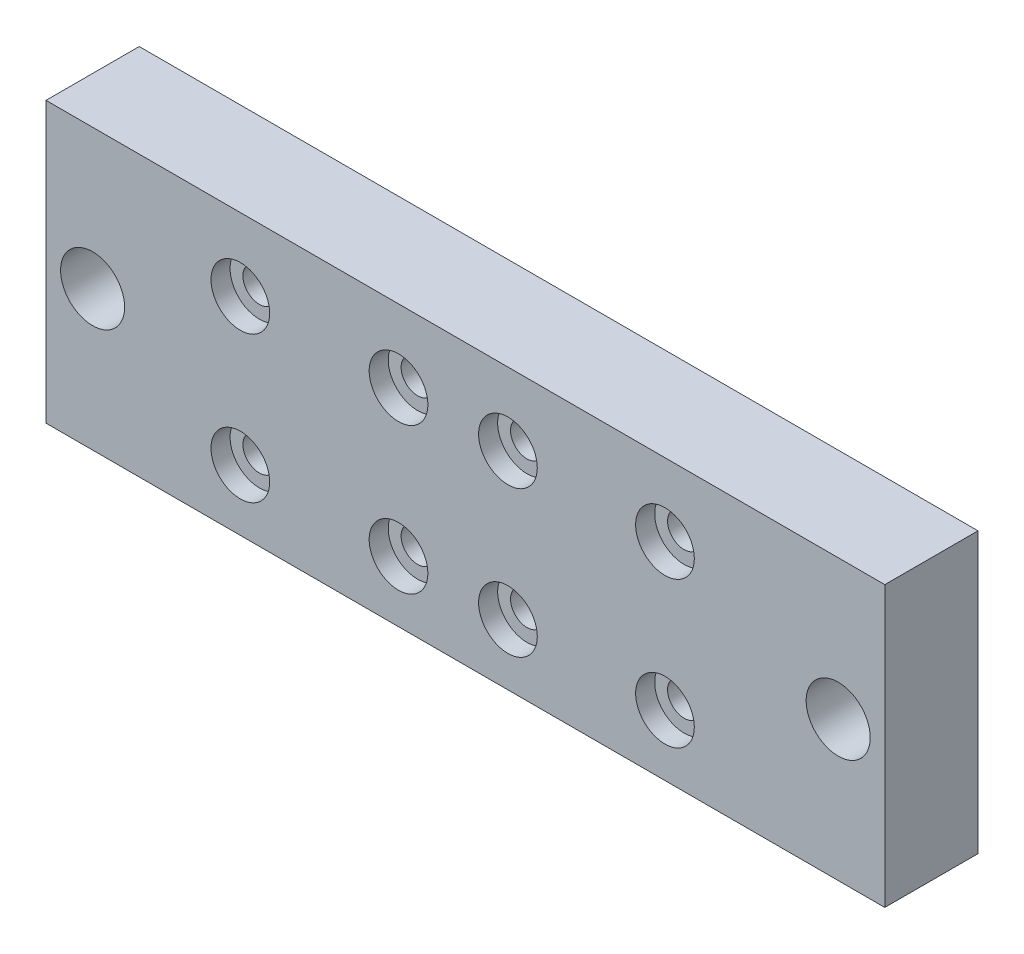
ISO-10303-21;
HEADER;
FILE_DESCRIPTION(('STEP AP214'),'2;1');
FILE_NAME('part.step','',(''),(''),'','','');
FILE_SCHEMA(('AUTOMOTIVE_DESIGN { 1 0 10303 214 1 1 1 1 }'));
ENDSEC;
DATA;
#1=APPLICATION_CONTEXT('core data for automotive mechanical design processes');
#2=APPLICATION_PROTOCOL_DEFINITION('international standard','automotive_design',2000,#1);
#3=PRODUCT_CONTEXT('',#1,'mechanical');
#4=PRODUCT('Part','Part','',(#3));
#5=PRODUCT_RELATED_PRODUCT_CATEGORY('part','',(#4));
#6=PRODUCT_DEFINITION_FORMATION('','',#4);
#7=PRODUCT_DEFINITION_CONTEXT('part definition',#1,'design');
#8=PRODUCT_DEFINITION('design','',#6,#7);
#9=PRODUCT_DEFINITION_SHAPE('','',#8);
#10=(LENGTH_UNIT() NAMED_UNIT(*) SI_UNIT(.MILLI.,.METRE.));
#11=(NAMED_UNIT(*) PLANE_ANGLE_UNIT() SI_UNIT($,.RADIAN.));
#12=(NAMED_UNIT(*) SI_UNIT($,.STERADIAN.) SOLID_ANGLE_UNIT());
#13=UNCERTAINTY_MEASURE_WITH_UNIT(LENGTH_MEASURE(1.E-05),#10,'distance_accuracy_value','');
#14=(GEOMETRIC_REPRESENTATION_CONTEXT(3) GLOBAL_UNCERTAINTY_ASSIGNED_CONTEXT((#13)) GLOBAL_UNIT_ASSIGNED_CONTEXT((#10,
#11,#12)) REPRESENTATION_CONTEXT('',''));
#15=CARTESIAN_POINT('',(0.,0.,0.));
#16=DIRECTION('',(0.,0.,1.));
#17=DIRECTION('',(1.,0.,0.));
#18=AXIS2_PLACEMENT_3D('',#15,#16,#17);
#19=CARTESIAN_POINT('',(0.,0.,12.7));
#20=DIRECTION('',(1.,0.,0.));
#21=DIRECTION('',(0.,0.,-1.));
#22=AXIS2_PLACEMENT_3D('',#19,#20,#21);
#23=PLANE('',#22);
#24=DIRECTION('',(0.,-1.,0.));
#25=VECTOR('',#24,1.);
#26=CARTESIAN_POINT('',(0.,0.,0.));
#27=LINE('',#26,#25);
#28=CARTESIAN_POINT('',(0.,38.1,0.));
#29=VERTEX_POINT('',#28);
#30=CARTESIAN_POINT('',(0.,0.,0.));
#31=VERTEX_POINT('',#30);
#32=EDGE_CURVE('E101',#29,#31,#27,.T.);
#33=ORIENTED_EDGE('',*,*,#32,.T.);
#34=DIRECTION('',(0.,0.,-1.));
#35=VECTOR('',#34,1.);
#36=CARTESIAN_POINT('',(0.,0.,12.7));
#37=LINE('',#36,#35);
#38=CARTESIAN_POINT('',(0.,0.,12.7));
#39=VERTEX_POINT('',#38);
#40=EDGE_CURVE('E11',#39,#31,#37,.T.);
#41=ORIENTED_EDGE('',*,*,#40,.F.);
#42=DIRECTION('',(0.,-1.,0.));
#43=VECTOR('',#42,1.);
#44=CARTESIAN_POINT('',(0.,0.,12.7));
#45=LINE('',#44,#43);
#46=CARTESIAN_POINT('',(0.,38.1,12.7));
#47=VERTEX_POINT('',#46);
#48=EDGE_CURVE('E88',#47,#39,#45,.T.);
#49=ORIENTED_EDGE('',*,*,#48,.F.);
#50=DIRECTION('',(0.,0.,-1.));
#51=VECTOR('',#50,1.);
#52=CARTESIAN_POINT('',(0.,38.1,12.7));
#53=LINE('',#52,#51);
#54=EDGE_CURVE('E97',#47,#29,#53,.T.);
#55=ORIENTED_EDGE('',*,*,#54,.T.);
#56=EDGE_LOOP('',(#33,#41,#49,#55));
#57=FACE_BOUND('',#56,.T.);
#58=ADVANCED_FACE('F35',(#57),#23,.F.);
#59=CARTESIAN_POINT('',(0.,0.,12.7));
#60=DIRECTION('',(0.,1.,0.));
#61=DIRECTION('',(0.,0.,1.));
#62=AXIS2_PLACEMENT_3D('',#59,#60,#61);
#63=PLANE('',#62);
#64=DIRECTION('',(1.,0.,0.));
#65=VECTOR('',#64,1.);
#66=CARTESIAN_POINT('',(0.,0.,0.));
#67=LINE('',#66,#65);
#68=CARTESIAN_POINT('',(114.3,0.,0.));
#69=VERTEX_POINT('',#68);
#70=EDGE_CURVE('E92',#31,#69,#67,.T.);
#71=ORIENTED_EDGE('',*,*,#70,.T.);
#72=DIRECTION('',(0.,0.,-1.));
#73=VECTOR('',#72,1.);
#74=CARTESIAN_POINT('',(114.3,0.,12.7));
#75=LINE('',#74,#73);
#76=CARTESIAN_POINT('',(114.3,0.,12.7));
#77=VERTEX_POINT('',#76);
#78=EDGE_CURVE('E44',#77,#69,#75,.T.);
#79=ORIENTED_EDGE('',*,*,#78,.F.);
#80=DIRECTION('',(1.,0.,0.));
#81=VECTOR('',#80,1.);
#82=CARTESIAN_POINT('',(0.,0.,12.7));
#83=LINE('',#82,#81);
#84=EDGE_CURVE('E83',#39,#77,#83,.T.);
#85=ORIENTED_EDGE('',*,*,#84,.F.);
#86=ORIENTED_EDGE('',*,*,#40,.T.);
#87=EDGE_LOOP('',(#71,#79,#85,#86));
#88=FACE_BOUND('',#87,.T.);
#89=ADVANCED_FACE('F91',(#88),#63,.F.);
#90=CARTESIAN_POINT('',(114.3,0.,12.7));
#91=DIRECTION('',(-1.,0.,0.));
#92=DIRECTION('',(0.,0.,1.));
#93=AXIS2_PLACEMENT_3D('',#90,#91,#92);
#94=PLANE('',#93);
#95=DIRECTION('',(0.,1.,0.));
#96=VECTOR('',#95,1.);
#97=CARTESIAN_POINT('',(114.3,0.,0.));
#98=LINE('',#97,#96);
#99=CARTESIAN_POINT('',(114.3,38.1,0.));
#100=VERTEX_POINT('',#99);
#101=EDGE_CURVE('E70',#69,#100,#98,.T.);
#102=ORIENTED_EDGE('',*,*,#101,.T.);
#103=DIRECTION('',(0.,0.,-1.));
#104=VECTOR('',#103,1.);
#105=CARTESIAN_POINT('',(114.3,38.1,12.7));
#106=LINE('',#105,#104);
#107=CARTESIAN_POINT('',(114.3,38.1,12.7));
#108=VERTEX_POINT('',#107);
#109=EDGE_CURVE('E93',#108,#100,#106,.T.);
#110=ORIENTED_EDGE('',*,*,#109,.F.);
#111=DIRECTION('',(0.,1.,0.));
#112=VECTOR('',#111,1.);
#113=CARTESIAN_POINT('',(114.3,0.,12.7));
#114=LINE('',#113,#112);
#115=EDGE_CURVE('E86',#77,#108,#114,.T.);
#116=ORIENTED_EDGE('',*,*,#115,.F.);
#117=ORIENTED_EDGE('',*,*,#78,.T.);
#118=EDGE_LOOP('',(#102,#110,#116,#117));
#119=FACE_BOUND('',#118,.T.);
#120=ADVANCED_FACE('F95',(#119),#94,.F.);
#121=CARTESIAN_POINT('',(0.,38.1,12.7));
#122=DIRECTION('',(0.,-1.,0.));
#123=DIRECTION('',(0.,0.,-1.));
#124=AXIS2_PLACEMENT_3D('',#121,#122,#123);
#125=PLANE('',#124);
#126=DIRECTION('',(-1.,0.,0.));
#127=VECTOR('',#126,1.);
#128=CARTESIAN_POINT('',(0.,38.1,0.));
#129=LINE('',#128,#127);
#130=EDGE_CURVE('E76',#100,#29,#129,.T.);
#131=ORIENTED_EDGE('',*,*,#130,.T.);
#132=ORIENTED_EDGE('',*,*,#54,.F.);
#133=DIRECTION('',(-1.,0.,0.));
#134=VECTOR('',#133,1.);
#135=CARTESIAN_POINT('',(0.,38.1,12.7));
#136=LINE('',#135,#134);
#137=EDGE_CURVE('E53',#108,#47,#136,.T.);
#138=ORIENTED_EDGE('',*,*,#137,.F.);
#139=ORIENTED_EDGE('',*,*,#109,.T.);
#140=EDGE_LOOP('',(#131,#132,#138,#139));
#141=FACE_BOUND('',#140,.T.);
#142=ADVANCED_FACE('F213',(#141),#125,.F.);
#143=CARTESIAN_POINT('',(0.,0.,12.7));
#144=DIRECTION('',(0.,0.,-1.));
#145=DIRECTION('',(-1.,0.,0.));
#146=AXIS2_PLACEMENT_3D('',#143,#144,#145);
#147=PLANE('',#146);
#148=CARTESIAN_POINT('',(6.34999999999999,19.05,12.7));
#149=DIRECTION('',(0.,0.,1.));
#150=DIRECTION('',(1.,0.,0.));
#151=AXIS2_PLACEMENT_3D('',#148,#149,#150);
#152=CIRCLE('',#151,4.365625);
#153=CARTESIAN_POINT('',(10.715625,19.05,12.7));
#154=VERTEX_POINT('',#153);
#155=EDGE_CURVE('E510',#154,#154,#152,.T.);
#156=ORIENTED_EDGE('',*,*,#155,.F.);
#157=EDGE_LOOP('',(#156));
#158=FACE_BOUND('',#157,.T.);
#159=CARTESIAN_POINT('',(107.95,19.05,12.7));
#160=DIRECTION('',(0.,0.,1.));
#161=DIRECTION('',(1.,0.,0.));
#162=AXIS2_PLACEMENT_3D('',#159,#160,#161);
#163=CIRCLE('',#162,4.365625);
#164=CARTESIAN_POINT('',(112.315625,19.05,12.7));
#165=VERTEX_POINT('',#164);
#166=EDGE_CURVE('E512',#165,#165,#163,.T.);
#167=ORIENTED_EDGE('',*,*,#166,.F.);
#168=EDGE_LOOP('',(#167));
#169=FACE_BOUND('',#168,.T.);
#170=CARTESIAN_POINT('',(26.4785372058469,28.2047734815833,12.7));
#171=DIRECTION('',(0.,0.,1.));
#172=DIRECTION('',(1.,0.,0.));
#173=AXIS2_PLACEMENT_3D('',#170,#171,#172);
#174=CIRCLE('',#173,3.99999999999999);
#175=CARTESIAN_POINT('',(30.4785372058469,28.2047734815833,12.7));
#176=VERTEX_POINT('',#175);
#177=EDGE_CURVE('E520',#176,#176,#174,.T.);
#178=ORIENTED_EDGE('',*,*,#177,.F.);
#179=EDGE_LOOP('',(#178));
#180=FACE_BOUND('',#179,.T.);
#181=CARTESIAN_POINT('',(48.0366294398635,28.2047734815833,12.7));
#182=DIRECTION('',(0.,0.,1.));
#183=DIRECTION('',(1.,0.,0.));
#184=AXIS2_PLACEMENT_3D('',#181,#182,#183);
#185=CIRCLE('',#184,3.99999999999999);
#186=CARTESIAN_POINT('',(52.0366294398635,28.2047734815833,12.7));
#187=VERTEX_POINT('',#186);
#188=EDGE_CURVE('E152',#187,#187,#185,.T.);
#189=ORIENTED_EDGE('',*,*,#188,.F.);
#190=EDGE_LOOP('',(#189));
#191=FACE_BOUND('',#190,.T.);
#192=CARTESIAN_POINT('',(62.9471428436403,28.2047734815833,12.7));
#193=DIRECTION('',(0.,0.,1.));
#194=DIRECTION('',(1.,0.,0.));
#195=AXIS2_PLACEMENT_3D('',#192,#193,#194);
#196=CIRCLE('',#195,3.99999999999999);
#197=CARTESIAN_POINT('',(66.9471428436403,28.2047734815833,12.7));
#198=VERTEX_POINT('',#197);
#199=EDGE_CURVE('E139',#198,#198,#196,.T.);
#200=ORIENTED_EDGE('',*,*,#199,.F.);
#201=EDGE_LOOP('',(#200));
#202=FACE_BOUND('',#201,.T.);
#203=CARTESIAN_POINT('',(84.3455589166382,28.2047734815833,12.7));
#204=DIRECTION('',(0.,0.,1.));
#205=DIRECTION('',(1.,0.,0.));
#206=AXIS2_PLACEMENT_3D('',#203,#204,#205);
#207=CIRCLE('',#206,3.99999999999999);
#208=CARTESIAN_POINT('',(88.3455589166382,28.2047734815833,12.7));
#209=VERTEX_POINT('',#208);
#210=EDGE_CURVE('E135',#209,#209,#207,.T.);
#211=ORIENTED_EDGE('',*,*,#210,.F.);
#212=EDGE_LOOP('',(#211));
#213=FACE_BOUND('',#212,.T.);
#214=CARTESIAN_POINT('',(84.3455589166382,8.3033395981218,12.7));
#215=DIRECTION('',(0.,0.,1.));
#216=DIRECTION('',(1.,0.,0.));
#217=AXIS2_PLACEMENT_3D('',#214,#215,#216);
#218=CIRCLE('',#217,3.99999999999999);
#219=CARTESIAN_POINT('',(88.3455589166382,8.3033395981218,12.7));
#220=VERTEX_POINT('',#219);
#221=EDGE_CURVE('E131',#220,#220,#218,.T.);
#222=ORIENTED_EDGE('',*,*,#221,.F.);
#223=EDGE_LOOP('',(#222));
#224=FACE_BOUND('',#223,.T.);
#225=CARTESIAN_POINT('',(62.9471428436403,8.3033395981218,12.7));
#226=DIRECTION('',(0.,0.,1.));
#227=DIRECTION('',(1.,0.,0.));
#228=AXIS2_PLACEMENT_3D('',#225,#226,#227);
#229=CIRCLE('',#228,3.99999999999999);
#230=CARTESIAN_POINT('',(66.9471428436403,8.3033395981218,12.7));
#231=VERTEX_POINT('',#230);
#232=EDGE_CURVE('E126',#231,#231,#229,.T.);
#233=ORIENTED_EDGE('',*,*,#232,.F.);
#234=EDGE_LOOP('',(#233));
#235=FACE_BOUND('',#234,.T.);
#236=CARTESIAN_POINT('',(48.0366294398635,8.3033395981218,12.7));
#237=DIRECTION('',(0.,0.,1.));
#238=DIRECTION('',(1.,0.,0.));
#239=AXIS2_PLACEMENT_3D('',#236,#237,#238);
#240=CIRCLE('',#239,3.99999999999999);
#241=CARTESIAN_POINT('',(52.0366294398635,8.3033395981218,12.7));
#242=VERTEX_POINT('',#241);
#243=EDGE_CURVE('E121',#242,#242,#240,.T.);
#244=ORIENTED_EDGE('',*,*,#243,.F.);
#245=EDGE_LOOP('',(#244));
#246=FACE_BOUND('',#245,.T.);
#247=CARTESIAN_POINT('',(26.4785372058469,8.3033395981218,12.7));
#248=DIRECTION('',(0.,0.,1.));
#249=DIRECTION('',(1.,0.,0.));
#250=AXIS2_PLACEMENT_3D('',#247,#248,#249);
#251=CIRCLE('',#250,3.99999999999999);
#252=CARTESIAN_POINT('',(30.4785372058469,8.3033395981218,12.7));
#253=VERTEX_POINT('',#252);
#254=EDGE_CURVE('E116',#253,#253,#251,.T.);
#255=ORIENTED_EDGE('',*,*,#254,.F.);
#256=EDGE_LOOP('',(#255));
#257=FACE_BOUND('',#256,.T.);
#258=ORIENTED_EDGE('',*,*,#48,.T.);
#259=ORIENTED_EDGE('',*,*,#84,.T.);
#260=ORIENTED_EDGE('',*,*,#115,.T.);
#261=ORIENTED_EDGE('',*,*,#137,.T.);
#262=EDGE_LOOP('',(#258,#259,#260,#261));
#263=FACE_BOUND('',#262,.T.);
#264=ADVANCED_FACE('F84',(#158,#169,#180,#191,#202,#213,#224,#235,#246,#257,#263),#147,.F.);
#265=CARTESIAN_POINT('',(0.,0.,0.));
#266=DIRECTION('',(0.,0.,-1.));
#267=DIRECTION('',(-1.,0.,0.));
#268=AXIS2_PLACEMENT_3D('',#265,#266,#267);
#269=PLANE('',#268);
#270=CARTESIAN_POINT('',(6.34999999999999,19.05,0.));
#271=DIRECTION('',(0.,0.,1.));
#272=DIRECTION('',(1.,0.,0.));
#273=AXIS2_PLACEMENT_3D('',#270,#271,#272);
#274=CIRCLE('',#273,4.365625);
#275=CARTESIAN_POINT('',(10.715625,19.05,0.));
#276=VERTEX_POINT('',#275);
#277=EDGE_CURVE('E508',#276,#276,#274,.T.);
#278=ORIENTED_EDGE('',*,*,#277,.T.);
#279=EDGE_LOOP('',(#278));
#280=FACE_BOUND('',#279,.T.);
#281=CARTESIAN_POINT('',(107.95,19.05,0.));
#282=DIRECTION('',(0.,0.,1.));
#283=DIRECTION('',(1.,0.,0.));
#284=AXIS2_PLACEMENT_3D('',#281,#282,#283);
#285=CIRCLE('',#284,4.365625);
#286=CARTESIAN_POINT('',(112.315625,19.05,0.));
#287=VERTEX_POINT('',#286);
#288=EDGE_CURVE('E517',#287,#287,#285,.T.);
#289=ORIENTED_EDGE('',*,*,#288,.T.);
#290=EDGE_LOOP('',(#289));
#291=FACE_BOUND('',#290,.T.);
#292=CARTESIAN_POINT('',(26.4785372058469,28.2047734815833,0.));
#293=DIRECTION('',(0.,0.,-1.));
#294=DIRECTION('',(-1.,0.,0.));
#295=AXIS2_PLACEMENT_3D('',#292,#293,#294);
#296=CIRCLE('',#295,2.24999999999999);
#297=CARTESIAN_POINT('',(24.2285372058469,28.2047734815833,0.));
#298=VERTEX_POINT('',#297);
#299=EDGE_CURVE('E38',#298,#298,#296,.T.);
#300=ORIENTED_EDGE('',*,*,#299,.F.);
#301=EDGE_LOOP('',(#300));
#302=FACE_BOUND('',#301,.T.);
#303=CARTESIAN_POINT('',(48.0366294398635,28.2047734815833,0.));
#304=DIRECTION('',(0.,0.,-1.));
#305=DIRECTION('',(-1.,0.,0.));
#306=AXIS2_PLACEMENT_3D('',#303,#304,#305);
#307=CIRCLE('',#306,2.24999999999999);
#308=CARTESIAN_POINT('',(45.7866294398635,28.2047734815833,0.));
#309=VERTEX_POINT('',#308);
#310=EDGE_CURVE('E137',#309,#309,#307,.T.);
#311=ORIENTED_EDGE('',*,*,#310,.F.);
#312=EDGE_LOOP('',(#311));
#313=FACE_BOUND('',#312,.T.);
#314=CARTESIAN_POINT('',(62.9471428436403,28.2047734815833,0.));
#315=DIRECTION('',(0.,0.,-1.));
#316=DIRECTION('',(-1.,0.,0.));
#317=AXIS2_PLACEMENT_3D('',#314,#315,#316);
#318=CIRCLE('',#317,2.25);
#319=CARTESIAN_POINT('',(60.6971428436403,28.2047734815833,0.));
#320=VERTEX_POINT('',#319);
#321=EDGE_CURVE('E133',#320,#320,#318,.T.);
#322=ORIENTED_EDGE('',*,*,#321,.F.);
#323=EDGE_LOOP('',(#322));
#324=FACE_BOUND('',#323,.T.);
#325=CARTESIAN_POINT('',(84.3455589166382,28.2047734815833,0.));
#326=DIRECTION('',(0.,0.,-1.));
#327=DIRECTION('',(-1.,0.,0.));
#328=AXIS2_PLACEMENT_3D('',#325,#326,#327);
#329=CIRCLE('',#328,2.25);
#330=CARTESIAN_POINT('',(82.0955589166382,28.2047734815833,0.));
#331=VERTEX_POINT('',#330);
#332=EDGE_CURVE('E128',#331,#331,#329,.T.);
#333=ORIENTED_EDGE('',*,*,#332,.F.);
#334=EDGE_LOOP('',(#333));
#335=FACE_BOUND('',#334,.T.);
#336=CARTESIAN_POINT('',(84.3455589166382,8.3033395981218,0.));
#337=DIRECTION('',(0.,0.,-1.));
#338=DIRECTION('',(-1.,0.,0.));
#339=AXIS2_PLACEMENT_3D('',#336,#337,#338);
#340=CIRCLE('',#339,2.25);
#341=CARTESIAN_POINT('',(82.0955589166382,8.3033395981218,0.));
#342=VERTEX_POINT('',#341);
#343=EDGE_CURVE('E123',#342,#342,#340,.T.);
#344=ORIENTED_EDGE('',*,*,#343,.F.);
#345=EDGE_LOOP('',(#344));
#346=FACE_BOUND('',#345,.T.);
#347=CARTESIAN_POINT('',(62.9471428436403,8.3033395981218,0.));
#348=DIRECTION('',(0.,0.,-1.));
#349=DIRECTION('',(-1.,0.,0.));
#350=AXIS2_PLACEMENT_3D('',#347,#348,#349);
#351=CIRCLE('',#350,2.25);
#352=CARTESIAN_POINT('',(60.6971428436403,8.3033395981218,0.));
#353=VERTEX_POINT('',#352);
#354=EDGE_CURVE('E118',#353,#353,#351,.T.);
#355=ORIENTED_EDGE('',*,*,#354,.F.);
#356=EDGE_LOOP('',(#355));
#357=FACE_BOUND('',#356,.T.);
#358=CARTESIAN_POINT('',(48.0366294398635,8.3033395981218,0.));
#359=DIRECTION('',(0.,0.,-1.));
#360=DIRECTION('',(-1.,0.,0.));
#361=AXIS2_PLACEMENT_3D('',#358,#359,#360);
#362=CIRCLE('',#361,2.24999999999999);
#363=CARTESIAN_POINT('',(45.7866294398635,8.3033395981218,0.));
#364=VERTEX_POINT('',#363);
#365=EDGE_CURVE('E113',#364,#364,#362,.T.);
#366=ORIENTED_EDGE('',*,*,#365,.F.);
#367=EDGE_LOOP('',(#366));
#368=FACE_BOUND('',#367,.T.);
#369=CARTESIAN_POINT('',(26.4785372058469,8.3033395981218,0.));
#370=DIRECTION('',(0.,0.,-1.));
#371=DIRECTION('',(-1.,0.,0.));
#372=AXIS2_PLACEMENT_3D('',#369,#370,#371);
#373=CIRCLE('',#372,2.24999999999999);
#374=CARTESIAN_POINT('',(24.2285372058469,8.3033395981218,0.));
#375=VERTEX_POINT('',#374);
#376=EDGE_CURVE('E104',#375,#375,#373,.T.);
#377=ORIENTED_EDGE('',*,*,#376,.F.);
#378=EDGE_LOOP('',(#377));
#379=FACE_BOUND('',#378,.T.);
#380=ORIENTED_EDGE('',*,*,#32,.F.);
#381=ORIENTED_EDGE('',*,*,#130,.F.);
#382=ORIENTED_EDGE('',*,*,#101,.F.);
#383=ORIENTED_EDGE('',*,*,#70,.F.);
#384=EDGE_LOOP('',(#380,#381,#382,#383));
#385=FACE_BOUND('',#384,.T.);
#386=ADVANCED_FACE('F212',(#280,#291,#302,#313,#324,#335,#346,#357,#368,#379,#385),#269,.T.);
#387=CARTESIAN_POINT('',(26.4785372058469,8.3033395981218,12.7));
#388=DIRECTION('',(0.,0.,1.));
#389=DIRECTION('',(1.,0.,0.));
#390=AXIS2_PLACEMENT_3D('',#387,#388,#389);
#391=CYLINDRICAL_SURFACE('',#390,2.24999999999999);
#392=ORIENTED_EDGE('',*,*,#376,.T.);
#393=EDGE_LOOP('',(#392));
#394=FACE_BOUND('',#393,.T.);
#395=CARTESIAN_POINT('',(26.4785372058469,8.3033395981218,10.1));
#396=DIRECTION('',(0.,0.,1.));
#397=DIRECTION('',(1.,0.,0.));
#398=AXIS2_PLACEMENT_3D('',#395,#396,#397);
#399=CIRCLE('',#398,2.25);
#400=CARTESIAN_POINT('',(28.7285372058469,8.3033395981218,10.1));
#401=VERTEX_POINT('',#400);
#402=EDGE_CURVE('E112',#401,#401,#399,.T.);
#403=ORIENTED_EDGE('',*,*,#402,.T.);
#404=EDGE_LOOP('',(#403));
#405=FACE_BOUND('',#404,.T.);
#406=ADVANCED_FACE('F196',(#394,#405),#391,.F.);
#407=CARTESIAN_POINT('',(28.7285372058469,8.3033395981218,10.1));
#408=DIRECTION('',(0.,0.,-1.));
#409=DIRECTION('',(-1.,0.,0.));
#410=AXIS2_PLACEMENT_3D('',#407,#408,#409);
#411=PLANE('',#410);
#412=ORIENTED_EDGE('',*,*,#402,.F.);
#413=EDGE_LOOP('',(#412));
#414=FACE_BOUND('',#413,.T.);
#415=CARTESIAN_POINT('',(26.4785372058469,8.3033395981218,10.1));
#416=DIRECTION('',(0.,0.,1.));
#417=DIRECTION('',(1.,0.,0.));
#418=AXIS2_PLACEMENT_3D('',#415,#416,#417);
#419=CIRCLE('',#418,3.99999999999999);
#420=CARTESIAN_POINT('',(30.4785372058469,8.3033395981218,10.1));
#421=VERTEX_POINT('',#420);
#422=EDGE_CURVE('E190',#421,#421,#419,.T.);
#423=ORIENTED_EDGE('',*,*,#422,.T.);
#424=EDGE_LOOP('',(#423));
#425=FACE_BOUND('',#424,.T.);
#426=ADVANCED_FACE('F198',(#414,#425),#411,.F.);
#427=CARTESIAN_POINT('',(26.4785372058469,8.3033395981218,12.7));
#428=DIRECTION('',(0.,0.,1.));
#429=DIRECTION('',(1.,0.,0.));
#430=AXIS2_PLACEMENT_3D('',#427,#428,#429);
#431=CYLINDRICAL_SURFACE('',#430,3.99999999999999);
#432=ORIENTED_EDGE('',*,*,#422,.F.);
#433=EDGE_LOOP('',(#432));
#434=FACE_BOUND('',#433,.T.);
#435=ORIENTED_EDGE('',*,*,#254,.T.);
#436=EDGE_LOOP('',(#435));
#437=FACE_BOUND('',#436,.T.);
#438=ADVANCED_FACE('F201',(#434,#437),#431,.F.);
#439=CARTESIAN_POINT('',(48.0366294398635,8.3033395981218,12.7));
#440=DIRECTION('',(0.,0.,1.));
#441=DIRECTION('',(1.,0.,0.));
#442=AXIS2_PLACEMENT_3D('',#439,#440,#441);
#443=CYLINDRICAL_SURFACE('',#442,2.24999999999999);
#444=ORIENTED_EDGE('',*,*,#365,.T.);
#445=EDGE_LOOP('',(#444));
#446=FACE_BOUND('',#445,.T.);
#447=CARTESIAN_POINT('',(48.0366294398635,8.3033395981218,10.1));
#448=DIRECTION('',(0.,0.,1.));
#449=DIRECTION('',(1.,0.,0.));
#450=AXIS2_PLACEMENT_3D('',#447,#448,#449);
#451=CIRCLE('',#450,2.25);
#452=CARTESIAN_POINT('',(50.2866294398635,8.3033395981218,10.1));
#453=VERTEX_POINT('',#452);
#454=EDGE_CURVE('E117',#453,#453,#451,.T.);
#455=ORIENTED_EDGE('',*,*,#454,.T.);
#456=EDGE_LOOP('',(#455));
#457=FACE_BOUND('',#456,.T.);
#458=ADVANCED_FACE('F207',(#446,#457),#443,.F.);
#459=CARTESIAN_POINT('',(50.2866294398635,8.3033395981218,10.1));
#460=DIRECTION('',(0.,0.,-1.));
#461=DIRECTION('',(-1.,0.,0.));
#462=AXIS2_PLACEMENT_3D('',#459,#460,#461);
#463=PLANE('',#462);
#464=ORIENTED_EDGE('',*,*,#454,.F.);
#465=EDGE_LOOP('',(#464));
#466=FACE_BOUND('',#465,.T.);
#467=CARTESIAN_POINT('',(48.0366294398635,8.3033395981218,10.1));
#468=DIRECTION('',(0.,0.,1.));
#469=DIRECTION('',(1.,0.,0.));
#470=AXIS2_PLACEMENT_3D('',#467,#468,#469);
#471=CIRCLE('',#470,3.99999999999999);
#472=CARTESIAN_POINT('',(52.0366294398635,8.3033395981218,10.1));
#473=VERTEX_POINT('',#472);
#474=EDGE_CURVE('E183',#473,#473,#471,.T.);
#475=ORIENTED_EDGE('',*,*,#474,.T.);
#476=EDGE_LOOP('',(#475));
#477=FACE_BOUND('',#476,.T.);
#478=ADVANCED_FACE('F274',(#466,#477),#463,.F.);
#479=CARTESIAN_POINT('',(48.0366294398635,8.3033395981218,12.7));
#480=DIRECTION('',(0.,0.,1.));
#481=DIRECTION('',(1.,0.,0.));
#482=AXIS2_PLACEMENT_3D('',#479,#480,#481);
#483=CYLINDRICAL_SURFACE('',#482,3.99999999999999);
#484=ORIENTED_EDGE('',*,*,#474,.F.);
#485=EDGE_LOOP('',(#484));
#486=FACE_BOUND('',#485,.T.);
#487=ORIENTED_EDGE('',*,*,#243,.T.);
#488=EDGE_LOOP('',(#487));
#489=FACE_BOUND('',#488,.T.);
#490=ADVANCED_FACE('F284',(#486,#489),#483,.F.);
#491=CARTESIAN_POINT('',(62.9471428436403,8.3033395981218,12.7));
#492=DIRECTION('',(0.,0.,1.));
#493=DIRECTION('',(1.,0.,0.));
#494=AXIS2_PLACEMENT_3D('',#491,#492,#493);
#495=CYLINDRICAL_SURFACE('',#494,2.25);
#496=ORIENTED_EDGE('',*,*,#354,.T.);
#497=EDGE_LOOP('',(#496));
#498=FACE_BOUND('',#497,.T.);
#499=CARTESIAN_POINT('',(62.9471428436403,8.3033395981218,10.1));
#500=DIRECTION('',(0.,0.,1.));
#501=DIRECTION('',(1.,0.,0.));
#502=AXIS2_PLACEMENT_3D('',#499,#500,#501);
#503=CIRCLE('',#502,2.25);
#504=CARTESIAN_POINT('',(65.1971428436403,8.3033395981218,10.1));
#505=VERTEX_POINT('',#504);
#506=EDGE_CURVE('E122',#505,#505,#503,.T.);
#507=ORIENTED_EDGE('',*,*,#506,.T.);
#508=EDGE_LOOP('',(#507));
#509=FACE_BOUND('',#508,.T.);
#510=ADVANCED_FACE('F294',(#498,#509),#495,.F.);
#511=CARTESIAN_POINT('',(65.1971428436403,8.3033395981218,10.1));
#512=DIRECTION('',(0.,0.,-1.));
#513=DIRECTION('',(-1.,0.,0.));
#514=AXIS2_PLACEMENT_3D('',#511,#512,#513);
#515=PLANE('',#514);
#516=ORIENTED_EDGE('',*,*,#506,.F.);
#517=EDGE_LOOP('',(#516));
#518=FACE_BOUND('',#517,.T.);
#519=CARTESIAN_POINT('',(62.9471428436403,8.3033395981218,10.1));
#520=DIRECTION('',(0.,0.,1.));
#521=DIRECTION('',(1.,0.,0.));
#522=AXIS2_PLACEMENT_3D('',#519,#520,#521);
#523=CIRCLE('',#522,3.99999999999999);
#524=CARTESIAN_POINT('',(66.9471428436403,8.3033395981218,10.1));
#525=VERTEX_POINT('',#524);
#526=EDGE_CURVE('E176',#525,#525,#523,.T.);
#527=ORIENTED_EDGE('',*,*,#526,.T.);
#528=EDGE_LOOP('',(#527));
#529=FACE_BOUND('',#528,.T.);
#530=ADVANCED_FACE('F304',(#518,#529),#515,.F.);
#531=CARTESIAN_POINT('',(62.9471428436403,8.3033395981218,12.7));
#532=DIRECTION('',(0.,0.,1.));
#533=DIRECTION('',(1.,0.,0.));
#534=AXIS2_PLACEMENT_3D('',#531,#532,#533);
#535=CYLINDRICAL_SURFACE('',#534,3.99999999999999);
#536=ORIENTED_EDGE('',*,*,#526,.F.);
#537=EDGE_LOOP('',(#536));
#538=FACE_BOUND('',#537,.T.);
#539=ORIENTED_EDGE('',*,*,#232,.T.);
#540=EDGE_LOOP('',(#539));
#541=FACE_BOUND('',#540,.T.);
#542=ADVANCED_FACE('F314',(#538,#541),#535,.F.);
#543=CARTESIAN_POINT('',(84.3455589166382,8.3033395981218,12.7));
#544=DIRECTION('',(0.,0.,1.));
#545=DIRECTION('',(1.,0.,0.));
#546=AXIS2_PLACEMENT_3D('',#543,#544,#545);
#547=CYLINDRICAL_SURFACE('',#546,2.25);
#548=ORIENTED_EDGE('',*,*,#343,.T.);
#549=EDGE_LOOP('',(#548));
#550=FACE_BOUND('',#549,.T.);
#551=CARTESIAN_POINT('',(84.3455589166382,8.3033395981218,10.1));
#552=DIRECTION('',(0.,0.,1.));
#553=DIRECTION('',(1.,0.,0.));
#554=AXIS2_PLACEMENT_3D('',#551,#552,#553);
#555=CIRCLE('',#554,2.25);
#556=CARTESIAN_POINT('',(86.5955589166382,8.3033395981218,10.1));
#557=VERTEX_POINT('',#556);
#558=EDGE_CURVE('E127',#557,#557,#555,.T.);
#559=ORIENTED_EDGE('',*,*,#558,.T.);
#560=EDGE_LOOP('',(#559));
#561=FACE_BOUND('',#560,.T.);
#562=ADVANCED_FACE('F324',(#550,#561),#547,.F.);
#563=CARTESIAN_POINT('',(86.5955589166382,8.3033395981218,10.1));
#564=DIRECTION('',(0.,0.,-1.));
#565=DIRECTION('',(-1.,0.,0.));
#566=AXIS2_PLACEMENT_3D('',#563,#564,#565);
#567=PLANE('',#566);
#568=ORIENTED_EDGE('',*,*,#558,.F.);
#569=EDGE_LOOP('',(#568));
#570=FACE_BOUND('',#569,.T.);
#571=CARTESIAN_POINT('',(84.3455589166382,8.3033395981218,10.1));
#572=DIRECTION('',(0.,0.,1.));
#573=DIRECTION('',(1.,0.,0.));
#574=AXIS2_PLACEMENT_3D('',#571,#572,#573);
#575=CIRCLE('',#574,3.99999999999999);
#576=CARTESIAN_POINT('',(88.3455589166382,8.3033395981218,10.1));
#577=VERTEX_POINT('',#576);
#578=EDGE_CURVE('E169',#577,#577,#575,.T.);
#579=ORIENTED_EDGE('',*,*,#578,.T.);
#580=EDGE_LOOP('',(#579));
#581=FACE_BOUND('',#580,.T.);
#582=ADVANCED_FACE('F334',(#570,#581),#567,.F.);
#583=CARTESIAN_POINT('',(84.3455589166382,8.3033395981218,12.7));
#584=DIRECTION('',(0.,0.,1.));
#585=DIRECTION('',(1.,0.,0.));
#586=AXIS2_PLACEMENT_3D('',#583,#584,#585);
#587=CYLINDRICAL_SURFACE('',#586,3.99999999999999);
#588=ORIENTED_EDGE('',*,*,#578,.F.);
#589=EDGE_LOOP('',(#588));
#590=FACE_BOUND('',#589,.T.);
#591=ORIENTED_EDGE('',*,*,#221,.T.);
#592=EDGE_LOOP('',(#591));
#593=FACE_BOUND('',#592,.T.);
#594=ADVANCED_FACE('F344',(#590,#593),#587,.F.);
#595=CARTESIAN_POINT('',(84.3455589166382,28.2047734815833,12.7));
#596=DIRECTION('',(0.,0.,1.));
#597=DIRECTION('',(1.,0.,0.));
#598=AXIS2_PLACEMENT_3D('',#595,#596,#597);
#599=CYLINDRICAL_SURFACE('',#598,2.25);
#600=ORIENTED_EDGE('',*,*,#332,.T.);
#601=EDGE_LOOP('',(#600));
#602=FACE_BOUND('',#601,.T.);
#603=CARTESIAN_POINT('',(84.3455589166382,28.2047734815833,10.1));
#604=DIRECTION('',(0.,0.,1.));
#605=DIRECTION('',(1.,0.,0.));
#606=AXIS2_PLACEMENT_3D('',#603,#604,#605);
#607=CIRCLE('',#606,2.25);
#608=CARTESIAN_POINT('',(86.5955589166382,28.2047734815833,10.1));
#609=VERTEX_POINT('',#608);
#610=EDGE_CURVE('E132',#609,#609,#607,.T.);
#611=ORIENTED_EDGE('',*,*,#610,.T.);
#612=EDGE_LOOP('',(#611));
#613=FACE_BOUND('',#612,.T.);
#614=ADVANCED_FACE('F354',(#602,#613),#599,.F.);
#615=CARTESIAN_POINT('',(86.5955589166382,28.2047734815833,10.1));
#616=DIRECTION('',(0.,0.,-1.));
#617=DIRECTION('',(-1.,0.,0.));
#618=AXIS2_PLACEMENT_3D('',#615,#616,#617);
#619=PLANE('',#618);
#620=ORIENTED_EDGE('',*,*,#610,.F.);
#621=EDGE_LOOP('',(#620));
#622=FACE_BOUND('',#621,.T.);
#623=CARTESIAN_POINT('',(84.3455589166382,28.2047734815833,10.1));
#624=DIRECTION('',(0.,0.,1.));
#625=DIRECTION('',(1.,0.,0.));
#626=AXIS2_PLACEMENT_3D('',#623,#624,#625);
#627=CIRCLE('',#626,3.99999999999999);
#628=CARTESIAN_POINT('',(88.3455589166382,28.2047734815833,10.1));
#629=VERTEX_POINT('',#628);
#630=EDGE_CURVE('E162',#629,#629,#627,.T.);
#631=ORIENTED_EDGE('',*,*,#630,.T.);
#632=EDGE_LOOP('',(#631));
#633=FACE_BOUND('',#632,.T.);
#634=ADVANCED_FACE('F364',(#622,#633),#619,.F.);
#635=CARTESIAN_POINT('',(84.3455589166382,28.2047734815833,12.7));
#636=DIRECTION('',(0.,0.,1.));
#637=DIRECTION('',(1.,0.,0.));
#638=AXIS2_PLACEMENT_3D('',#635,#636,#637);
#639=CYLINDRICAL_SURFACE('',#638,3.99999999999999);
#640=ORIENTED_EDGE('',*,*,#630,.F.);
#641=EDGE_LOOP('',(#640));
#642=FACE_BOUND('',#641,.T.);
#643=ORIENTED_EDGE('',*,*,#210,.T.);
#644=EDGE_LOOP('',(#643));
#645=FACE_BOUND('',#644,.T.);
#646=ADVANCED_FACE('F374',(#642,#645),#639,.F.);
#647=CARTESIAN_POINT('',(62.9471428436403,28.2047734815833,12.7));
#648=DIRECTION('',(0.,0.,1.));
#649=DIRECTION('',(1.,0.,0.));
#650=AXIS2_PLACEMENT_3D('',#647,#648,#649);
#651=CYLINDRICAL_SURFACE('',#650,2.25);
#652=ORIENTED_EDGE('',*,*,#321,.T.);
#653=EDGE_LOOP('',(#652));
#654=FACE_BOUND('',#653,.T.);
#655=CARTESIAN_POINT('',(62.9471428436403,28.2047734815833,10.1));
#656=DIRECTION('',(0.,0.,1.));
#657=DIRECTION('',(1.,0.,0.));
#658=AXIS2_PLACEMENT_3D('',#655,#656,#657);
#659=CIRCLE('',#658,2.25);
#660=CARTESIAN_POINT('',(65.1971428436403,28.2047734815833,10.1));
#661=VERTEX_POINT('',#660);
#662=EDGE_CURVE('E136',#661,#661,#659,.T.);
#663=ORIENTED_EDGE('',*,*,#662,.T.);
#664=EDGE_LOOP('',(#663));
#665=FACE_BOUND('',#664,.T.);
#666=ADVANCED_FACE('F384',(#654,#665),#651,.F.);
#667=CARTESIAN_POINT('',(65.1971428436403,28.2047734815833,10.1));
#668=DIRECTION('',(0.,0.,-1.));
#669=DIRECTION('',(-1.,0.,0.));
#670=AXIS2_PLACEMENT_3D('',#667,#668,#669);
#671=PLANE('',#670);
#672=ORIENTED_EDGE('',*,*,#662,.F.);
#673=EDGE_LOOP('',(#672));
#674=FACE_BOUND('',#673,.T.);
#675=CARTESIAN_POINT('',(62.9471428436403,28.2047734815833,10.1));
#676=DIRECTION('',(0.,0.,1.));
#677=DIRECTION('',(1.,0.,0.));
#678=AXIS2_PLACEMENT_3D('',#675,#676,#677);
#679=CIRCLE('',#678,3.99999999999999);
#680=CARTESIAN_POINT('',(66.9471428436403,28.2047734815833,10.1));
#681=VERTEX_POINT('',#680);
#682=EDGE_CURVE('E144',#681,#681,#679,.T.);
#683=ORIENTED_EDGE('',*,*,#682,.T.);
#684=EDGE_LOOP('',(#683));
#685=FACE_BOUND('',#684,.T.);
#686=ADVANCED_FACE('F394',(#674,#685),#671,.F.);
#687=CARTESIAN_POINT('',(62.9471428436403,28.2047734815833,12.7));
#688=DIRECTION('',(0.,0.,1.));
#689=DIRECTION('',(1.,0.,0.));
#690=AXIS2_PLACEMENT_3D('',#687,#688,#689);
#691=CYLINDRICAL_SURFACE('',#690,3.99999999999999);
#692=ORIENTED_EDGE('',*,*,#682,.F.);
#693=EDGE_LOOP('',(#692));
#694=FACE_BOUND('',#693,.T.);
#695=ORIENTED_EDGE('',*,*,#199,.T.);
#696=EDGE_LOOP('',(#695));
#697=FACE_BOUND('',#696,.T.);
#698=ADVANCED_FACE('F404',(#694,#697),#691,.F.);
#699=CARTESIAN_POINT('',(48.0366294398635,28.2047734815833,12.7));
#700=DIRECTION('',(0.,0.,1.));
#701=DIRECTION('',(1.,0.,0.));
#702=AXIS2_PLACEMENT_3D('',#699,#700,#701);
#703=CYLINDRICAL_SURFACE('',#702,2.24999999999999);
#704=ORIENTED_EDGE('',*,*,#310,.T.);
#705=EDGE_LOOP('',(#704));
#706=FACE_BOUND('',#705,.T.);
#707=CARTESIAN_POINT('',(48.0366294398635,28.2047734815833,10.1));
#708=DIRECTION('',(0.,0.,1.));
#709=DIRECTION('',(1.,0.,0.));
#710=AXIS2_PLACEMENT_3D('',#707,#708,#709);
#711=CIRCLE('',#710,2.25);
#712=CARTESIAN_POINT('',(50.2866294398635,28.2047734815833,10.1));
#713=VERTEX_POINT('',#712);
#714=EDGE_CURVE('E140',#713,#713,#711,.T.);
#715=ORIENTED_EDGE('',*,*,#714,.T.);
#716=EDGE_LOOP('',(#715));
#717=FACE_BOUND('',#716,.T.);
#718=ADVANCED_FACE('F414',(#706,#717),#703,.F.);
#719=CARTESIAN_POINT('',(50.2866294398635,28.2047734815833,10.1));
#720=DIRECTION('',(0.,0.,-1.));
#721=DIRECTION('',(-1.,0.,0.));
#722=AXIS2_PLACEMENT_3D('',#719,#720,#721);
#723=PLANE('',#722);
#724=ORIENTED_EDGE('',*,*,#714,.F.);
#725=EDGE_LOOP('',(#724));
#726=FACE_BOUND('',#725,.T.);
#727=CARTESIAN_POINT('',(48.0366294398635,28.2047734815833,10.1));
#728=DIRECTION('',(0.,0.,1.));
#729=DIRECTION('',(1.,0.,0.));
#730=AXIS2_PLACEMENT_3D('',#727,#728,#729);
#731=CIRCLE('',#730,3.99999999999999);
#732=CARTESIAN_POINT('',(52.0366294398635,28.2047734815833,10.1));
#733=VERTEX_POINT('',#732);
#734=EDGE_CURVE('E147',#733,#733,#731,.T.);
#735=ORIENTED_EDGE('',*,*,#734,.T.);
#736=EDGE_LOOP('',(#735));
#737=FACE_BOUND('',#736,.T.);
#738=ADVANCED_FACE('F424',(#726,#737),#723,.F.);
#739=CARTESIAN_POINT('',(48.0366294398635,28.2047734815833,12.7));
#740=DIRECTION('',(0.,0.,1.));
#741=DIRECTION('',(1.,0.,0.));
#742=AXIS2_PLACEMENT_3D('',#739,#740,#741);
#743=CYLINDRICAL_SURFACE('',#742,3.99999999999999);
#744=ORIENTED_EDGE('',*,*,#734,.F.);
#745=EDGE_LOOP('',(#744));
#746=FACE_BOUND('',#745,.T.);
#747=ORIENTED_EDGE('',*,*,#188,.T.);
#748=EDGE_LOOP('',(#747));
#749=FACE_BOUND('',#748,.T.);
#750=ADVANCED_FACE('F433',(#746,#749),#743,.F.);
#751=CARTESIAN_POINT('',(26.4785372058469,28.2047734815833,12.7));
#752=DIRECTION('',(0.,0.,1.));
#753=DIRECTION('',(1.,0.,0.));
#754=AXIS2_PLACEMENT_3D('',#751,#752,#753);
#755=CYLINDRICAL_SURFACE('',#754,2.24999999999999);
#756=ORIENTED_EDGE('',*,*,#299,.T.);
#757=EDGE_LOOP('',(#756));
#758=FACE_BOUND('',#757,.T.);
#759=CARTESIAN_POINT('',(26.4785372058469,28.2047734815833,10.1));
#760=DIRECTION('',(0.,0.,1.));
#761=DIRECTION('',(1.,0.,0.));
#762=AXIS2_PLACEMENT_3D('',#759,#760,#761);
#763=CIRCLE('',#762,2.25);
#764=CARTESIAN_POINT('',(28.7285372058469,28.2047734815833,10.1));
#765=VERTEX_POINT('',#764);
#766=EDGE_CURVE('E526',#765,#765,#763,.T.);
#767=ORIENTED_EDGE('',*,*,#766,.T.);
#768=EDGE_LOOP('',(#767));
#769=FACE_BOUND('',#768,.T.);
#770=ADVANCED_FACE('F443',(#758,#769),#755,.F.);
#771=CARTESIAN_POINT('',(28.7285372058469,28.2047734815833,10.1));
#772=DIRECTION('',(0.,0.,-1.));
#773=DIRECTION('',(-1.,0.,0.));
#774=AXIS2_PLACEMENT_3D('',#771,#772,#773);
#775=PLANE('',#774);
#776=ORIENTED_EDGE('',*,*,#766,.F.);
#777=EDGE_LOOP('',(#776));
#778=FACE_BOUND('',#777,.T.);
#779=CARTESIAN_POINT('',(26.4785372058469,28.2047734815833,10.1));
#780=DIRECTION('',(0.,0.,1.));
#781=DIRECTION('',(1.,0.,0.));
#782=AXIS2_PLACEMENT_3D('',#779,#780,#781);
#783=CIRCLE('',#782,3.99999999999999);
#784=CARTESIAN_POINT('',(30.4785372058469,28.2047734815833,10.1));
#785=VERTEX_POINT('',#784);
#786=EDGE_CURVE('E523',#785,#785,#783,.T.);
#787=ORIENTED_EDGE('',*,*,#786,.T.);
#788=EDGE_LOOP('',(#787));
#789=FACE_BOUND('',#788,.T.);
#790=ADVANCED_FACE('F453',(#778,#789),#775,.F.);
#791=CARTESIAN_POINT('',(26.4785372058469,28.2047734815833,12.7));
#792=DIRECTION('',(0.,0.,1.));
#793=DIRECTION('',(1.,0.,0.));
#794=AXIS2_PLACEMENT_3D('',#791,#792,#793);
#795=CYLINDRICAL_SURFACE('',#794,3.99999999999999);
#796=ORIENTED_EDGE('',*,*,#786,.F.);
#797=EDGE_LOOP('',(#796));
#798=FACE_BOUND('',#797,.T.);
#799=ORIENTED_EDGE('',*,*,#177,.T.);
#800=EDGE_LOOP('',(#799));
#801=FACE_BOUND('',#800,.T.);
#802=ADVANCED_FACE('F463',(#798,#801),#795,.F.);
#803=CARTESIAN_POINT('',(107.95,19.05,12.7));
#804=DIRECTION('',(0.,0.,1.));
#805=DIRECTION('',(1.,0.,0.));
#806=AXIS2_PLACEMENT_3D('',#803,#804,#805);
#807=CYLINDRICAL_SURFACE('',#806,4.365625);
#808=ORIENTED_EDGE('',*,*,#288,.F.);
#809=EDGE_LOOP('',(#808));
#810=FACE_BOUND('',#809,.T.);
#811=ORIENTED_EDGE('',*,*,#166,.T.);
#812=EDGE_LOOP('',(#811));
#813=FACE_BOUND('',#812,.T.);
#814=ADVANCED_FACE('F472',(#810,#813),#807,.F.);
#815=CARTESIAN_POINT('',(6.34999999999999,19.05,12.7));
#816=DIRECTION('',(0.,0.,1.));
#817=DIRECTION('',(1.,0.,0.));
#818=AXIS2_PLACEMENT_3D('',#815,#816,#817);
#819=CYLINDRICAL_SURFACE('',#818,4.365625);
#820=ORIENTED_EDGE('',*,*,#277,.F.);
#821=EDGE_LOOP('',(#820));
#822=FACE_BOUND('',#821,.T.);
#823=ORIENTED_EDGE('',*,*,#155,.T.);
#824=EDGE_LOOP('',(#823));
#825=FACE_BOUND('',#824,.T.);
#826=ADVANCED_FACE('F491',(#822,#825),#819,.F.);
#827=CLOSED_SHELL('',(#58,#89,#120,#142,#264,#386,#406,#426,#438,#458,#478,#490,#510,#530,#542,
#562,#582,#594,#614,#634,#646,#666,#686,#698,#718,#738,#750,#770,#790,#802,#814,#826));
#828=MANIFOLD_SOLID_BREP('B2',#827);
#829=ADVANCED_BREP_SHAPE_REPRESENTATION('',(#18,#828),#14);
#830=SHAPE_DEFINITION_REPRESENTATION(#9,#829);
ENDSEC;
END-ISO-10303-21;
